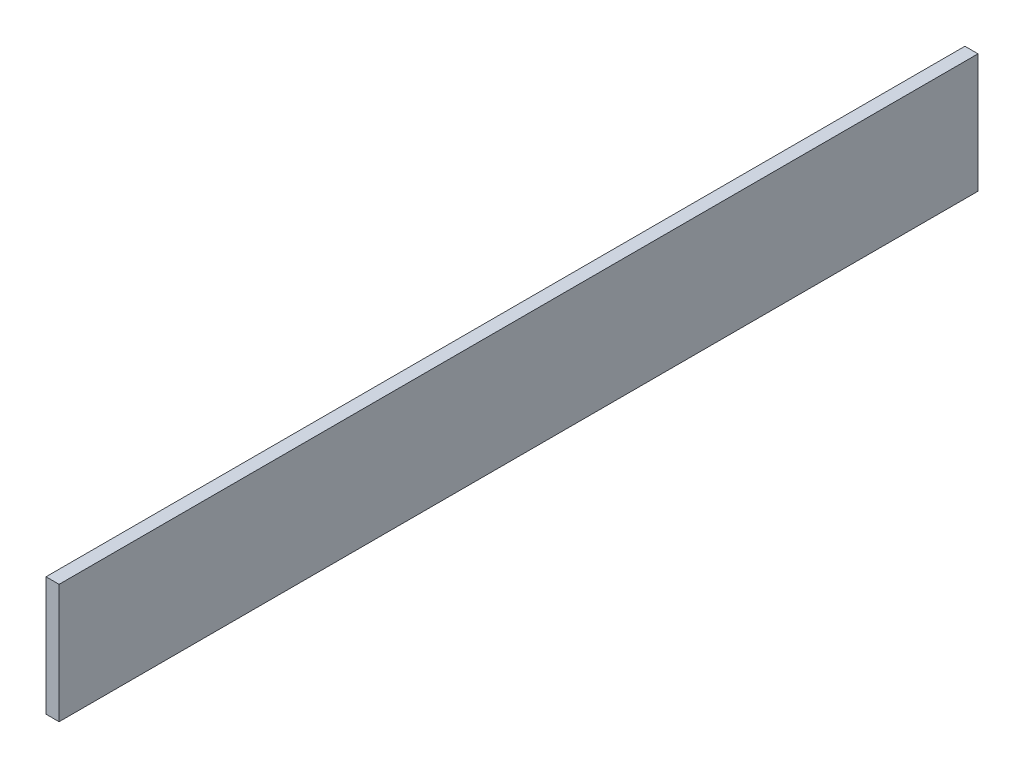
ISO-10303-21;
HEADER;
FILE_DESCRIPTION(('STEP AP214'),'2;1');
FILE_NAME('part.step','',(''),(''),'','','');
FILE_SCHEMA(('AUTOMOTIVE_DESIGN { 1 0 10303 214 1 1 1 1 }'));
ENDSEC;
DATA;
#1=APPLICATION_CONTEXT('core data for automotive mechanical design processes');
#2=APPLICATION_PROTOCOL_DEFINITION('international standard','automotive_design',2000,#1);
#3=PRODUCT_CONTEXT('',#1,'mechanical');
#4=PRODUCT('Part','Part','',(#3));
#5=PRODUCT_RELATED_PRODUCT_CATEGORY('part','',(#4));
#6=PRODUCT_DEFINITION_FORMATION('','',#4);
#7=PRODUCT_DEFINITION_CONTEXT('part definition',#1,'design');
#8=PRODUCT_DEFINITION('design','',#6,#7);
#9=PRODUCT_DEFINITION_SHAPE('','',#8);
#10=(LENGTH_UNIT() NAMED_UNIT(*) SI_UNIT(.MILLI.,.METRE.));
#11=(NAMED_UNIT(*) PLANE_ANGLE_UNIT() SI_UNIT($,.RADIAN.));
#12=(NAMED_UNIT(*) SI_UNIT($,.STERADIAN.) SOLID_ANGLE_UNIT());
#13=UNCERTAINTY_MEASURE_WITH_UNIT(LENGTH_MEASURE(1.E-05),#10,'distance_accuracy_value','');
#14=(GEOMETRIC_REPRESENTATION_CONTEXT(3) GLOBAL_UNCERTAINTY_ASSIGNED_CONTEXT((#13)) GLOBAL_UNIT_ASSIGNED_CONTEXT((#10,
#11,#12)) REPRESENTATION_CONTEXT('',''));
#15=CARTESIAN_POINT('',(0.,0.,0.));
#16=DIRECTION('',(0.,0.,1.));
#17=DIRECTION('',(1.,0.,0.));
#18=AXIS2_PLACEMENT_3D('',#15,#16,#17);
#19=CARTESIAN_POINT('',(22.,-99.9999999999999,-771.999999999999));
#20=DIRECTION('',(0.,1.,0.));
#21=DIRECTION('',(0.,0.,1.));
#22=AXIS2_PLACEMENT_3D('',#19,#20,#21);
#23=PLANE('',#22);
#24=DIRECTION('',(0.,0.,-1.));
#25=VECTOR('',#24,1.);
#26=CARTESIAN_POINT('',(0.,-99.9999999999999,-771.999999999999));
#27=LINE('',#26,#25);
#28=CARTESIAN_POINT('',(0.,-100.,772.));
#29=VERTEX_POINT('',#28);
#30=CARTESIAN_POINT('',(0.,-99.9999999999999,-771.999999999999));
#31=VERTEX_POINT('',#30);
#32=EDGE_CURVE('E96',#29,#31,#27,.T.);
#33=ORIENTED_EDGE('',*,*,#32,.T.);
#34=DIRECTION('',(-1.,0.,0.));
#35=VECTOR('',#34,1.);
#36=CARTESIAN_POINT('',(22.,-99.9999999999999,-771.999999999999));
#37=LINE('',#36,#35);
#38=CARTESIAN_POINT('',(22.,-99.9999999999999,-771.999999999999));
#39=VERTEX_POINT('',#38);
#40=EDGE_CURVE('E11',#39,#31,#37,.T.);
#41=ORIENTED_EDGE('',*,*,#40,.F.);
#42=DIRECTION('',(0.,0.,-1.));
#43=VECTOR('',#42,1.);
#44=CARTESIAN_POINT('',(22.,-99.9999999999999,-771.999999999999));
#45=LINE('',#44,#43);
#46=CARTESIAN_POINT('',(22.,-100.,772.));
#47=VERTEX_POINT('',#46);
#48=EDGE_CURVE('E84',#47,#39,#45,.T.);
#49=ORIENTED_EDGE('',*,*,#48,.F.);
#50=DIRECTION('',(-1.,0.,0.));
#51=VECTOR('',#50,1.);
#52=CARTESIAN_POINT('',(22.,-100.,772.));
#53=LINE('',#52,#51);
#54=EDGE_CURVE('E92',#47,#29,#53,.T.);
#55=ORIENTED_EDGE('',*,*,#54,.T.);
#56=EDGE_LOOP('',(#33,#41,#49,#55));
#57=FACE_BOUND('',#56,.T.);
#58=ADVANCED_FACE('F33',(#57),#23,.F.);
#59=CARTESIAN_POINT('',(22.,100.,-771.999999999999));
#60=DIRECTION('',(0.,0.,1.));
#61=DIRECTION('',(1.,0.,0.));
#62=AXIS2_PLACEMENT_3D('',#59,#60,#61);
#63=PLANE('',#62);
#64=DIRECTION('',(0.,1.,0.));
#65=VECTOR('',#64,1.);
#66=CARTESIAN_POINT('',(0.,100.,-771.999999999999));
#67=LINE('',#66,#65);
#68=CARTESIAN_POINT('',(0.,100.,-771.999999999999));
#69=VERTEX_POINT('',#68);
#70=EDGE_CURVE('E88',#31,#69,#67,.T.);
#71=ORIENTED_EDGE('',*,*,#70,.T.);
#72=DIRECTION('',(-1.,0.,0.));
#73=VECTOR('',#72,1.);
#74=CARTESIAN_POINT('',(22.,100.,-771.999999999999));
#75=LINE('',#74,#73);
#76=CARTESIAN_POINT('',(22.,100.,-771.999999999999));
#77=VERTEX_POINT('',#76);
#78=EDGE_CURVE('E41',#77,#69,#75,.T.);
#79=ORIENTED_EDGE('',*,*,#78,.F.);
#80=DIRECTION('',(0.,1.,0.));
#81=VECTOR('',#80,1.);
#82=CARTESIAN_POINT('',(22.,100.,-771.999999999999));
#83=LINE('',#82,#81);
#84=EDGE_CURVE('E79',#39,#77,#83,.T.);
#85=ORIENTED_EDGE('',*,*,#84,.F.);
#86=ORIENTED_EDGE('',*,*,#40,.T.);
#87=EDGE_LOOP('',(#71,#79,#85,#86));
#88=FACE_BOUND('',#87,.T.);
#89=ADVANCED_FACE('F87',(#88),#63,.F.);
#90=CARTESIAN_POINT('',(22.,100.,772.));
#91=DIRECTION('',(0.,-1.,0.));
#92=DIRECTION('',(0.,0.,-1.));
#93=AXIS2_PLACEMENT_3D('',#90,#91,#92);
#94=PLANE('',#93);
#95=DIRECTION('',(0.,0.,1.));
#96=VECTOR('',#95,1.);
#97=CARTESIAN_POINT('',(0.,100.,772.));
#98=LINE('',#97,#96);
#99=CARTESIAN_POINT('',(0.,100.,772.));
#100=VERTEX_POINT('',#99);
#101=EDGE_CURVE('E66',#69,#100,#98,.T.);
#102=ORIENTED_EDGE('',*,*,#101,.T.);
#103=DIRECTION('',(-1.,0.,0.));
#104=VECTOR('',#103,1.);
#105=CARTESIAN_POINT('',(22.,100.,772.));
#106=LINE('',#105,#104);
#107=CARTESIAN_POINT('',(22.,100.,772.));
#108=VERTEX_POINT('',#107);
#109=EDGE_CURVE('E89',#108,#100,#106,.T.);
#110=ORIENTED_EDGE('',*,*,#109,.F.);
#111=DIRECTION('',(0.,0.,1.));
#112=VECTOR('',#111,1.);
#113=CARTESIAN_POINT('',(22.,100.,772.));
#114=LINE('',#113,#112);
#115=EDGE_CURVE('E82',#77,#108,#114,.T.);
#116=ORIENTED_EDGE('',*,*,#115,.F.);
#117=ORIENTED_EDGE('',*,*,#78,.T.);
#118=EDGE_LOOP('',(#102,#110,#116,#117));
#119=FACE_BOUND('',#118,.T.);
#120=ADVANCED_FACE('F90',(#119),#94,.F.);
#121=CARTESIAN_POINT('',(22.,-100.,772.));
#122=DIRECTION('',(0.,0.,-1.));
#123=DIRECTION('',(-1.,0.,0.));
#124=AXIS2_PLACEMENT_3D('',#121,#122,#123);
#125=PLANE('',#124);
#126=DIRECTION('',(0.,-1.,0.));
#127=VECTOR('',#126,1.);
#128=CARTESIAN_POINT('',(0.,-100.,772.));
#129=LINE('',#128,#127);
#130=EDGE_CURVE('E72',#100,#29,#129,.T.);
#131=ORIENTED_EDGE('',*,*,#130,.T.);
#132=ORIENTED_EDGE('',*,*,#54,.F.);
#133=DIRECTION('',(0.,-1.,0.));
#134=VECTOR('',#133,1.);
#135=CARTESIAN_POINT('',(22.,-100.,772.));
#136=LINE('',#135,#134);
#137=EDGE_CURVE('E49',#108,#47,#136,.T.);
#138=ORIENTED_EDGE('',*,*,#137,.F.);
#139=ORIENTED_EDGE('',*,*,#109,.T.);
#140=EDGE_LOOP('',(#131,#132,#138,#139));
#141=FACE_BOUND('',#140,.T.);
#142=ADVANCED_FACE('F103',(#141),#125,.F.);
#143=CARTESIAN_POINT('',(22.,0.,0.));
#144=DIRECTION('',(-1.,0.,0.));
#145=DIRECTION('',(0.,0.,1.));
#146=AXIS2_PLACEMENT_3D('',#143,#144,#145);
#147=PLANE('',#146);
#148=ORIENTED_EDGE('',*,*,#48,.T.);
#149=ORIENTED_EDGE('',*,*,#84,.T.);
#150=ORIENTED_EDGE('',*,*,#115,.T.);
#151=ORIENTED_EDGE('',*,*,#137,.T.);
#152=EDGE_LOOP('',(#148,#149,#150,#151));
#153=FACE_BOUND('',#152,.T.);
#154=ADVANCED_FACE('F80',(#153),#147,.F.);
#155=CARTESIAN_POINT('',(0.,0.,0.));
#156=DIRECTION('',(-1.,0.,0.));
#157=DIRECTION('',(0.,0.,1.));
#158=AXIS2_PLACEMENT_3D('',#155,#156,#157);
#159=PLANE('',#158);
#160=ORIENTED_EDGE('',*,*,#32,.F.);
#161=ORIENTED_EDGE('',*,*,#130,.F.);
#162=ORIENTED_EDGE('',*,*,#101,.F.);
#163=ORIENTED_EDGE('',*,*,#70,.F.);
#164=EDGE_LOOP('',(#160,#161,#162,#163));
#165=FACE_BOUND('',#164,.T.);
#166=ADVANCED_FACE('F106',(#165),#159,.T.);
#167=CLOSED_SHELL('',(#58,#89,#120,#142,#154,#166));
#168=MANIFOLD_SOLID_BREP('B2',#167);
#169=ADVANCED_BREP_SHAPE_REPRESENTATION('',(#18,#168),#14);
#170=SHAPE_DEFINITION_REPRESENTATION(#9,#169);
ENDSEC;
END-ISO-10303-21;
